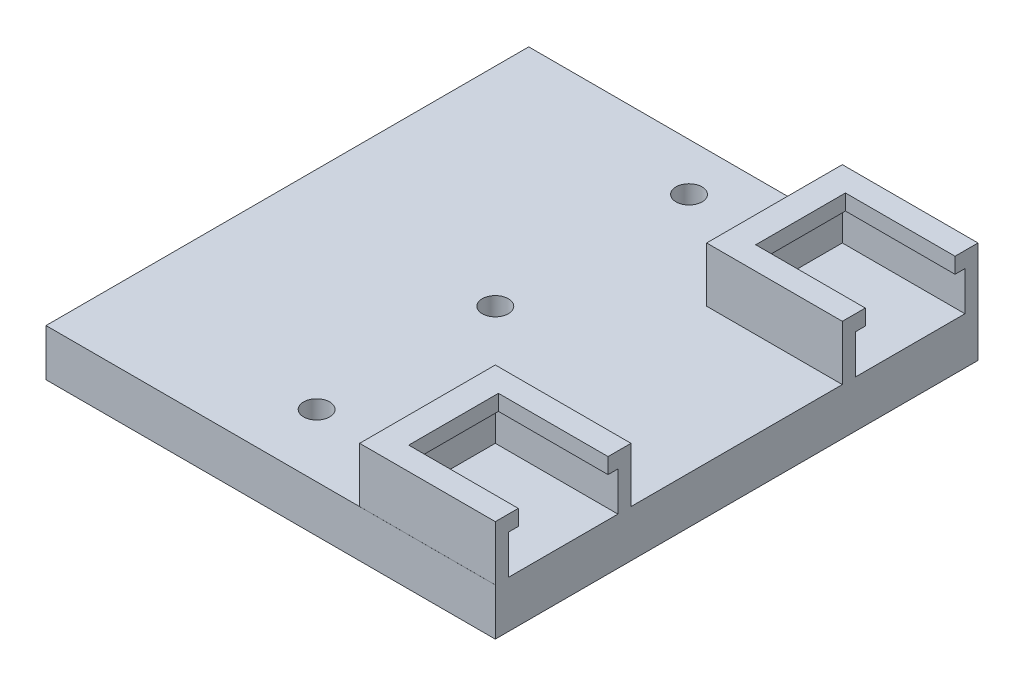
ISO-10303-21;
HEADER;
FILE_DESCRIPTION(('STEP AP214'),'2;1');
FILE_NAME('part.step','',(''),(''),'','','');
FILE_SCHEMA(('AUTOMOTIVE_DESIGN { 1 0 10303 214 1 1 1 1 }'));
ENDSEC;
DATA;
#1=APPLICATION_CONTEXT('core data for automotive mechanical design processes');
#2=APPLICATION_PROTOCOL_DEFINITION('international standard','automotive_design',2000,#1);
#3=PRODUCT_CONTEXT('',#1,'mechanical');
#4=PRODUCT('Part','Part','',(#3));
#5=PRODUCT_RELATED_PRODUCT_CATEGORY('part','',(#4));
#6=PRODUCT_DEFINITION_FORMATION('','',#4);
#7=PRODUCT_DEFINITION_CONTEXT('part definition',#1,'design');
#8=PRODUCT_DEFINITION('design','',#6,#7);
#9=PRODUCT_DEFINITION_SHAPE('','',#8);
#10=(LENGTH_UNIT() NAMED_UNIT(*) SI_UNIT(.MILLI.,.METRE.));
#11=(NAMED_UNIT(*) PLANE_ANGLE_UNIT() SI_UNIT($,.RADIAN.));
#12=(NAMED_UNIT(*) SI_UNIT($,.STERADIAN.) SOLID_ANGLE_UNIT());
#13=UNCERTAINTY_MEASURE_WITH_UNIT(LENGTH_MEASURE(1.E-05),#10,'distance_accuracy_value','');
#14=(GEOMETRIC_REPRESENTATION_CONTEXT(3) GLOBAL_UNCERTAINTY_ASSIGNED_CONTEXT((#13)) GLOBAL_UNIT_ASSIGNED_CONTEXT((#10,
#11,#12)) REPRESENTATION_CONTEXT('',''));
#15=CARTESIAN_POINT('',(0.,0.,0.));
#16=DIRECTION('',(0.,0.,1.));
#17=DIRECTION('',(1.,0.,0.));
#18=AXIS2_PLACEMENT_3D('',#15,#16,#17);
#19=CARTESIAN_POINT('',(0.,0.,0.));
#20=DIRECTION('',(0.,-1.,0.));
#21=DIRECTION('',(0.,0.,-1.));
#22=AXIS2_PLACEMENT_3D('',#19,#20,#21);
#23=PLANE('',#22);
#24=CARTESIAN_POINT('',(0.,0.,34.2453079122047));
#25=DIRECTION('',(0.,-1.,0.));
#26=DIRECTION('',(0.,0.,-1.));
#27=AXIS2_PLACEMENT_3D('',#24,#25,#26);
#28=CIRCLE('',#27,2.5);
#29=CARTESIAN_POINT('',(0.,0.,31.7453079122047));
#30=VERTEX_POINT('',#29);
#31=EDGE_CURVE('E456',#30,#30,#28,.T.);
#32=ORIENTED_EDGE('',*,*,#31,.F.);
#33=EDGE_LOOP('',(#32));
#34=FACE_BOUND('',#33,.T.);
#35=CARTESIAN_POINT('',(0.,0.,-37.1263663216455));
#36=DIRECTION('',(0.,-1.,0.));
#37=DIRECTION('',(0.,0.,-1.));
#38=AXIS2_PLACEMENT_3D('',#35,#36,#37);
#39=CIRCLE('',#38,2.5);
#40=CARTESIAN_POINT('',(0.,0.,-39.6263663216455));
#41=VERTEX_POINT('',#40);
#42=EDGE_CURVE('E449',#41,#41,#39,.T.);
#43=ORIENTED_EDGE('',*,*,#42,.F.);
#44=EDGE_LOOP('',(#43));
#45=FACE_BOUND('',#44,.T.);
#46=CARTESIAN_POINT('',(0.,0.,0.));
#47=DIRECTION('',(0.,-1.,0.));
#48=DIRECTION('',(0.,0.,-1.));
#49=AXIS2_PLACEMENT_3D('',#46,#47,#48);
#50=CIRCLE('',#49,2.5);
#51=CARTESIAN_POINT('',(0.,0.,-2.5));
#52=VERTEX_POINT('',#51);
#53=EDGE_CURVE('E269',#52,#52,#50,.T.);
#54=ORIENTED_EDGE('',*,*,#53,.F.);
#55=EDGE_LOOP('',(#54));
#56=FACE_BOUND('',#55,.T.);
#57=DIRECTION('',(1.,0.,0.));
#58=VECTOR('',#57,1.);
#59=CARTESIAN_POINT('',(0.,0.,-46.25));
#60=LINE('',#59,#58);
#61=CARTESIAN_POINT('',(-39.8470236313173,0.,-46.25));
#62=VERTEX_POINT('',#61);
#63=CARTESIAN_POINT('',(46.25,0.,-46.25));
#64=VERTEX_POINT('',#63);
#65=EDGE_CURVE('E228',#62,#64,#60,.T.);
#66=ORIENTED_EDGE('',*,*,#65,.T.);
#67=DIRECTION('',(0.,0.,1.));
#68=VECTOR('',#67,1.);
#69=CARTESIAN_POINT('',(46.25,0.,0.));
#70=LINE('',#69,#68);
#71=CARTESIAN_POINT('',(46.25,0.,46.258019));
#72=VERTEX_POINT('',#71);
#73=EDGE_CURVE('E263',#64,#72,#70,.T.);
#74=ORIENTED_EDGE('',*,*,#73,.T.);
#75=DIRECTION('',(-1.,0.,0.));
#76=VECTOR('',#75,1.);
#77=CARTESIAN_POINT('',(0.,0.,46.258019));
#78=LINE('',#77,#76);
#79=CARTESIAN_POINT('',(-39.8470236313173,0.,46.258019));
#80=VERTEX_POINT('',#79);
#81=EDGE_CURVE('E260',#72,#80,#78,.T.);
#82=ORIENTED_EDGE('',*,*,#81,.T.);
#83=DIRECTION('',(0.,0.,-1.));
#84=VECTOR('',#83,1.);
#85=CARTESIAN_POINT('',(-39.8470236313173,0.,0.));
#86=LINE('',#85,#84);
#87=EDGE_CURVE('E258',#80,#62,#86,.T.);
#88=ORIENTED_EDGE('',*,*,#87,.T.);
#89=EDGE_LOOP('',(#66,#74,#82,#88));
#90=FACE_BOUND('',#89,.T.);
#91=ADVANCED_FACE('F35',(#34,#45,#56,#90),#23,.T.);
#92=CARTESIAN_POINT('',(0.,9.,-69.5));
#93=DIRECTION('',(0.,-1.,0.));
#94=DIRECTION('',(0.,0.,-1.));
#95=AXIS2_PLACEMENT_3D('',#92,#93,#94);
#96=PLANE('',#95);
#97=DIRECTION('',(0.,0.,-1.));
#98=VECTOR('',#97,1.);
#99=CARTESIAN_POINT('',(46.25,9.,-46.25));
#100=LINE('',#99,#98);
#101=CARTESIAN_POINT('',(46.25,9.,-22.75));
#102=VERTEX_POINT('',#101);
#103=CARTESIAN_POINT('',(46.25,9.,-43.75));
#104=VERTEX_POINT('',#103);
#105=EDGE_CURVE('E250',#102,#104,#100,.T.);
#106=ORIENTED_EDGE('',*,*,#105,.T.);
#107=DIRECTION('',(-1.,0.,0.));
#108=VECTOR('',#107,1.);
#109=CARTESIAN_POINT('',(0.,9.,-43.75));
#110=LINE('',#109,#108);
#111=CARTESIAN_POINT('',(22.75,9.,-43.75));
#112=VERTEX_POINT('',#111);
#113=EDGE_CURVE('E310',#104,#112,#110,.T.);
#114=ORIENTED_EDGE('',*,*,#113,.T.);
#115=DIRECTION('',(0.,0.,-1.));
#116=VECTOR('',#115,1.);
#117=CARTESIAN_POINT('',(22.75,9.,0.));
#118=LINE('',#117,#116);
#119=CARTESIAN_POINT('',(22.75,9.,-22.75));
#120=VERTEX_POINT('',#119);
#121=EDGE_CURVE('E361',#120,#112,#118,.T.);
#122=ORIENTED_EDGE('',*,*,#121,.F.);
#123=DIRECTION('',(1.,0.,0.));
#124=VECTOR('',#123,1.);
#125=CARTESIAN_POINT('',(0.,9.,-22.75));
#126=LINE('',#125,#124);
#127=EDGE_CURVE('E365',#120,#102,#126,.T.);
#128=ORIENTED_EDGE('',*,*,#127,.T.);
#129=EDGE_LOOP('',(#106,#114,#122,#128));
#130=FACE_BOUND('',#129,.T.);
#131=ADVANCED_FACE('F469',(#130),#96,.F.);
#132=CARTESIAN_POINT('',(0.,9.,34.2453079122047));
#133=DIRECTION('',(0.,1.,0.));
#134=DIRECTION('',(0.,0.,1.));
#135=AXIS2_PLACEMENT_3D('',#132,#133,#134);
#136=CIRCLE('',#135,2.5);
#137=CARTESIAN_POINT('',(0.,9.,36.7453079122047));
#138=VERTEX_POINT('',#137);
#139=EDGE_CURVE('E461',#138,#138,#136,.T.);
#140=ORIENTED_EDGE('',*,*,#139,.F.);
#141=EDGE_LOOP('',(#140));
#142=FACE_BOUND('',#141,.T.);
#143=CARTESIAN_POINT('',(0.,9.,-37.1263663216455));
#144=DIRECTION('',(0.,1.,0.));
#145=DIRECTION('',(0.,0.,1.));
#146=AXIS2_PLACEMENT_3D('',#143,#144,#145);
#147=CIRCLE('',#146,2.5);
#148=CARTESIAN_POINT('',(0.,9.,-34.6263663216455));
#149=VERTEX_POINT('',#148);
#150=EDGE_CURVE('E452',#149,#149,#147,.T.);
#151=ORIENTED_EDGE('',*,*,#150,.F.);
#152=EDGE_LOOP('',(#151));
#153=FACE_BOUND('',#152,.T.);
#154=CARTESIAN_POINT('',(0.,9.,0.));
#155=DIRECTION('',(0.,1.,0.));
#156=DIRECTION('',(0.,0.,1.));
#157=AXIS2_PLACEMENT_3D('',#154,#155,#156);
#158=CIRCLE('',#157,2.5);
#159=CARTESIAN_POINT('',(0.,9.,2.5));
#160=VERTEX_POINT('',#159);
#161=EDGE_CURVE('E266',#160,#160,#158,.T.);
#162=ORIENTED_EDGE('',*,*,#161,.F.);
#163=EDGE_LOOP('',(#162));
#164=FACE_BOUND('',#163,.T.);
#165=CARTESIAN_POINT('',(46.25,9.,20.25));
#166=VERTEX_POINT('',#165);
#167=CARTESIAN_POINT('',(46.25,9.,-20.25));
#168=VERTEX_POINT('',#167);
#169=EDGE_CURVE('E447',#166,#168,#100,.T.);
#170=ORIENTED_EDGE('',*,*,#169,.T.);
#171=DIRECTION('',(-1.,0.,0.));
#172=VECTOR('',#171,1.);
#173=CARTESIAN_POINT('',(0.,9.,-20.25));
#174=LINE('',#173,#172);
#175=CARTESIAN_POINT('',(20.25,9.,-20.25));
#176=VERTEX_POINT('',#175);
#177=EDGE_CURVE('E368',#168,#176,#174,.T.);
#178=ORIENTED_EDGE('',*,*,#177,.T.);
#179=DIRECTION('',(0.,0.,-1.));
#180=VECTOR('',#179,1.);
#181=CARTESIAN_POINT('',(20.25,9.,0.));
#182=LINE('',#181,#180);
#183=CARTESIAN_POINT('',(20.25,9.,-46.25));
#184=VERTEX_POINT('',#183);
#185=EDGE_CURVE('E244',#176,#184,#182,.T.);
#186=ORIENTED_EDGE('',*,*,#185,.T.);
#187=DIRECTION('',(-1.,0.,0.));
#188=VECTOR('',#187,1.);
#189=CARTESIAN_POINT('',(46.25,9.,-46.25));
#190=LINE('',#189,#188);
#191=CARTESIAN_POINT('',(-39.8470236313173,9.,-46.25));
#192=VERTEX_POINT('',#191);
#193=EDGE_CURVE('E225',#184,#192,#190,.T.);
#194=ORIENTED_EDGE('',*,*,#193,.T.);
#195=DIRECTION('',(0.,0.,1.));
#196=VECTOR('',#195,1.);
#197=CARTESIAN_POINT('',(-39.8470236313173,9.,-46.25));
#198=LINE('',#197,#196);
#199=CARTESIAN_POINT('',(-39.8470236313173,9.,46.258019));
#200=VERTEX_POINT('',#199);
#201=EDGE_CURVE('E235',#192,#200,#198,.T.);
#202=ORIENTED_EDGE('',*,*,#201,.T.);
#203=DIRECTION('',(1.,0.,0.));
#204=VECTOR('',#203,1.);
#205=CARTESIAN_POINT('',(46.25,9.,46.258019));
#206=LINE('',#205,#204);
#207=CARTESIAN_POINT('',(46.25,9.,46.258019));
#208=VERTEX_POINT('',#207);
#209=EDGE_CURVE('E232',#200,#208,#206,.T.);
#210=ORIENTED_EDGE('',*,*,#209,.T.);
#211=CARTESIAN_POINT('',(46.25,9.,46.25));
#212=VERTEX_POINT('',#211);
#213=EDGE_CURVE('E246',#208,#212,#100,.T.);
#214=ORIENTED_EDGE('',*,*,#213,.T.);
#215=DIRECTION('',(-1.,0.,0.));
#216=VECTOR('',#215,1.);
#217=CARTESIAN_POINT('',(0.,9.,46.25));
#218=LINE('',#217,#216);
#219=CARTESIAN_POINT('',(20.25,9.,46.25));
#220=VERTEX_POINT('',#219);
#221=EDGE_CURVE('E320',#212,#220,#218,.T.);
#222=ORIENTED_EDGE('',*,*,#221,.T.);
#223=DIRECTION('',(0.,0.,1.));
#224=VECTOR('',#223,1.);
#225=CARTESIAN_POINT('',(20.25,9.,0.));
#226=LINE('',#225,#224);
#227=CARTESIAN_POINT('',(20.25,9.,20.25));
#228=VERTEX_POINT('',#227);
#229=EDGE_CURVE('E290',#228,#220,#226,.T.);
#230=ORIENTED_EDGE('',*,*,#229,.F.);
#231=DIRECTION('',(-1.,0.,0.));
#232=VECTOR('',#231,1.);
#233=CARTESIAN_POINT('',(0.,9.,20.25));
#234=LINE('',#233,#232);
#235=EDGE_CURVE('E291',#166,#228,#234,.T.);
#236=ORIENTED_EDGE('',*,*,#235,.F.);
#237=EDGE_LOOP('',(#170,#178,#186,#194,#202,#210,#214,#222,#230,#236));
#238=FACE_BOUND('',#237,.T.);
#239=ADVANCED_FACE('F242',(#142,#153,#164,#238),#96,.F.);
#240=CARTESIAN_POINT('',(46.25,9.,43.75));
#241=VERTEX_POINT('',#240);
#242=CARTESIAN_POINT('',(46.25,9.,22.75));
#243=VERTEX_POINT('',#242);
#244=EDGE_CURVE('E248',#241,#243,#100,.T.);
#245=ORIENTED_EDGE('',*,*,#244,.T.);
#246=DIRECTION('',(-1.,0.,0.));
#247=VECTOR('',#246,1.);
#248=CARTESIAN_POINT('',(0.,9.,22.75));
#249=LINE('',#248,#247);
#250=CARTESIAN_POINT('',(22.75,9.,22.75));
#251=VERTEX_POINT('',#250);
#252=EDGE_CURVE('E317',#243,#251,#249,.T.);
#253=ORIENTED_EDGE('',*,*,#252,.T.);
#254=DIRECTION('',(0.,0.,1.));
#255=VECTOR('',#254,1.);
#256=CARTESIAN_POINT('',(22.75,9.,0.));
#257=LINE('',#256,#255);
#258=CARTESIAN_POINT('',(22.75,9.,43.75));
#259=VERTEX_POINT('',#258);
#260=EDGE_CURVE('E313',#251,#259,#257,.T.);
#261=ORIENTED_EDGE('',*,*,#260,.T.);
#262=DIRECTION('',(1.,0.,0.));
#263=VECTOR('',#262,1.);
#264=CARTESIAN_POINT('',(0.,9.,43.75));
#265=LINE('',#264,#263);
#266=EDGE_CURVE('E316',#259,#241,#265,.T.);
#267=ORIENTED_EDGE('',*,*,#266,.T.);
#268=EDGE_LOOP('',(#245,#253,#261,#267));
#269=FACE_BOUND('',#268,.T.);
#270=ADVANCED_FACE('F444',(#269),#96,.F.);
#271=CARTESIAN_POINT('',(46.25,19.5,0.));
#272=DIRECTION('',(1.,0.,0.));
#273=DIRECTION('',(0.,0.,-1.));
#274=AXIS2_PLACEMENT_3D('',#271,#272,#273);
#275=PLANE('',#274);
#276=DIRECTION('',(0.,1.,0.));
#277=VECTOR('',#276,1.);
#278=CARTESIAN_POINT('',(46.25,19.5,24.65));
#279=LINE('',#278,#277);
#280=CARTESIAN_POINT('',(46.25,16.5,24.65));
#281=VERTEX_POINT('',#280);
#282=CARTESIAN_POINT('',(46.25,19.5,24.65));
#283=VERTEX_POINT('',#282);
#284=EDGE_CURVE('E106',#281,#283,#279,.T.);
#285=ORIENTED_EDGE('',*,*,#284,.F.);
#286=DIRECTION('',(0.,0.,-1.));
#287=VECTOR('',#286,1.);
#288=CARTESIAN_POINT('',(46.25,16.5,43.75));
#289=LINE('',#288,#287);
#290=CARTESIAN_POINT('',(46.25,16.5,22.75));
#291=VERTEX_POINT('',#290);
#292=EDGE_CURVE('E272',#281,#291,#289,.T.);
#293=ORIENTED_EDGE('',*,*,#292,.T.);
#294=DIRECTION('',(0.,-1.,0.));
#295=VECTOR('',#294,1.);
#296=CARTESIAN_POINT('',(46.25,19.5,22.75));
#297=LINE('',#296,#295);
#298=EDGE_CURVE('E283',#291,#243,#297,.T.);
#299=ORIENTED_EDGE('',*,*,#298,.T.);
#300=ORIENTED_EDGE('',*,*,#244,.F.);
#301=DIRECTION('',(0.,-1.,0.));
#302=VECTOR('',#301,1.);
#303=CARTESIAN_POINT('',(46.25,19.5,43.75));
#304=LINE('',#303,#302);
#305=CARTESIAN_POINT('',(46.25,16.5,43.75));
#306=VERTEX_POINT('',#305);
#307=EDGE_CURVE('E304',#306,#241,#304,.T.);
#308=ORIENTED_EDGE('',*,*,#307,.F.);
#309=CARTESIAN_POINT('',(46.25,16.5,41.85));
#310=VERTEX_POINT('',#309);
#311=EDGE_CURVE('E302',#306,#310,#289,.T.);
#312=ORIENTED_EDGE('',*,*,#311,.T.);
#313=DIRECTION('',(0.,-1.,0.));
#314=VECTOR('',#313,1.);
#315=CARTESIAN_POINT('',(46.25,19.5,41.85));
#316=LINE('',#315,#314);
#317=CARTESIAN_POINT('',(46.25,19.5,41.85));
#318=VERTEX_POINT('',#317);
#319=EDGE_CURVE('E398',#318,#310,#316,.T.);
#320=ORIENTED_EDGE('',*,*,#319,.F.);
#321=DIRECTION('',(0.,0.,1.));
#322=VECTOR('',#321,1.);
#323=CARTESIAN_POINT('',(46.25,19.5,0.));
#324=LINE('',#323,#322);
#325=CARTESIAN_POINT('',(46.25,19.5,46.25));
#326=VERTEX_POINT('',#325);
#327=EDGE_CURVE('E303',#318,#326,#324,.T.);
#328=ORIENTED_EDGE('',*,*,#327,.T.);
#329=DIRECTION('',(0.,-1.,0.));
#330=VECTOR('',#329,1.);
#331=CARTESIAN_POINT('',(46.25,19.5,46.25));
#332=LINE('',#331,#330);
#333=EDGE_CURVE('E299',#326,#212,#332,.T.);
#334=ORIENTED_EDGE('',*,*,#333,.T.);
#335=ORIENTED_EDGE('',*,*,#213,.F.);
#336=DIRECTION('',(0.,1.,0.));
#337=VECTOR('',#336,1.);
#338=CARTESIAN_POINT('',(46.25,-1.,46.258019));
#339=LINE('',#338,#337);
#340=EDGE_CURVE('E254',#72,#208,#339,.T.);
#341=ORIENTED_EDGE('',*,*,#340,.F.);
#342=ORIENTED_EDGE('',*,*,#73,.F.);
#343=DIRECTION('',(0.,-1.,0.));
#344=VECTOR('',#343,1.);
#345=CARTESIAN_POINT('',(46.25,19.5,-46.25));
#346=LINE('',#345,#344);
#347=CARTESIAN_POINT('',(46.25,19.5,-46.25));
#348=VERTEX_POINT('',#347);
#349=EDGE_CURVE('E52',#348,#64,#346,.T.);
#350=ORIENTED_EDGE('',*,*,#349,.F.);
#351=DIRECTION('',(0.,0.,-1.));
#352=VECTOR('',#351,1.);
#353=CARTESIAN_POINT('',(46.25,19.5,0.));
#354=LINE('',#353,#352);
#355=CARTESIAN_POINT('',(46.25,19.5,-41.85));
#356=VERTEX_POINT('',#355);
#357=EDGE_CURVE('E351',#356,#348,#354,.T.);
#358=ORIENTED_EDGE('',*,*,#357,.F.);
#359=DIRECTION('',(0.,-1.,0.));
#360=VECTOR('',#359,1.);
#361=CARTESIAN_POINT('',(46.25,19.5,-41.85));
#362=LINE('',#361,#360);
#363=CARTESIAN_POINT('',(46.25,16.5,-41.85));
#364=VERTEX_POINT('',#363);
#365=EDGE_CURVE('E336',#356,#364,#362,.T.);
#366=ORIENTED_EDGE('',*,*,#365,.T.);
#367=DIRECTION('',(0.,0.,-1.));
#368=VECTOR('',#367,1.);
#369=CARTESIAN_POINT('',(46.25,16.5,-22.75));
#370=LINE('',#369,#368);
#371=CARTESIAN_POINT('',(46.25,16.5,-43.75));
#372=VERTEX_POINT('',#371);
#373=EDGE_CURVE('E341',#364,#372,#370,.T.);
#374=ORIENTED_EDGE('',*,*,#373,.T.);
#375=DIRECTION('',(0.,-1.,0.));
#376=VECTOR('',#375,1.);
#377=CARTESIAN_POINT('',(46.25,19.5,-43.75));
#378=LINE('',#377,#376);
#379=EDGE_CURVE('E337',#372,#104,#378,.T.);
#380=ORIENTED_EDGE('',*,*,#379,.T.);
#381=ORIENTED_EDGE('',*,*,#105,.F.);
#382=DIRECTION('',(0.,-1.,0.));
#383=VECTOR('',#382,1.);
#384=CARTESIAN_POINT('',(46.25,19.5,-22.75));
#385=LINE('',#384,#383);
#386=CARTESIAN_POINT('',(46.25,16.5,-22.75));
#387=VERTEX_POINT('',#386);
#388=EDGE_CURVE('E355',#387,#102,#385,.T.);
#389=ORIENTED_EDGE('',*,*,#388,.F.);
#390=CARTESIAN_POINT('',(46.25,16.5,-24.65));
#391=VERTEX_POINT('',#390);
#392=EDGE_CURVE('E332',#387,#391,#370,.T.);
#393=ORIENTED_EDGE('',*,*,#392,.T.);
#394=DIRECTION('',(0.,1.,0.));
#395=VECTOR('',#394,1.);
#396=CARTESIAN_POINT('',(46.25,19.5,-24.65));
#397=LINE('',#396,#395);
#398=CARTESIAN_POINT('',(46.25,19.5,-24.65));
#399=VERTEX_POINT('',#398);
#400=EDGE_CURVE('E354',#391,#399,#397,.T.);
#401=ORIENTED_EDGE('',*,*,#400,.T.);
#402=CARTESIAN_POINT('',(46.25,19.5,-20.25));
#403=VERTEX_POINT('',#402);
#404=EDGE_CURVE('E277',#403,#399,#354,.T.);
#405=ORIENTED_EDGE('',*,*,#404,.F.);
#406=DIRECTION('',(0.,-1.,0.));
#407=VECTOR('',#406,1.);
#408=CARTESIAN_POINT('',(46.25,19.5,-20.25));
#409=LINE('',#408,#407);
#410=EDGE_CURVE('E344',#403,#168,#409,.T.);
#411=ORIENTED_EDGE('',*,*,#410,.T.);
#412=ORIENTED_EDGE('',*,*,#169,.F.);
#413=DIRECTION('',(0.,-1.,0.));
#414=VECTOR('',#413,1.);
#415=CARTESIAN_POINT('',(46.25,19.5,20.25));
#416=LINE('',#415,#414);
#417=CARTESIAN_POINT('',(46.25,19.5,20.25));
#418=VERTEX_POINT('',#417);
#419=EDGE_CURVE('E287',#418,#166,#416,.T.);
#420=ORIENTED_EDGE('',*,*,#419,.F.);
#421=EDGE_CURVE('E286',#418,#283,#324,.T.);
#422=ORIENTED_EDGE('',*,*,#421,.T.);
#423=EDGE_LOOP('',(#285,#293,#299,#300,#308,#312,#320,#328,#334,#335,#341,#342,#350,#358,#366,
#374,#380,#381,#389,#393,#401,#405,#411,#412,#420,#422));
#424=FACE_BOUND('',#423,.T.);
#425=ADVANCED_FACE('F437',(#424),#275,.T.);
#426=CARTESIAN_POINT('',(0.,19.5,-43.75));
#427=DIRECTION('',(0.,0.,1.));
#428=DIRECTION('',(1.,0.,0.));
#429=AXIS2_PLACEMENT_3D('',#426,#427,#428);
#430=PLANE('',#429);
#431=ORIENTED_EDGE('',*,*,#379,.F.);
#432=DIRECTION('',(-1.,0.,0.));
#433=VECTOR('',#432,1.);
#434=CARTESIAN_POINT('',(67.4632034355964,16.5,-43.75));
#435=LINE('',#434,#433);
#436=CARTESIAN_POINT('',(22.75,16.5,-43.75));
#437=VERTEX_POINT('',#436);
#438=EDGE_CURVE('E340',#372,#437,#435,.T.);
#439=ORIENTED_EDGE('',*,*,#438,.T.);
#440=DIRECTION('',(0.,-1.,0.));
#441=VECTOR('',#440,1.);
#442=CARTESIAN_POINT('',(22.75,19.5,-43.75));
#443=LINE('',#442,#441);
#444=EDGE_CURVE('E359',#437,#112,#443,.T.);
#445=ORIENTED_EDGE('',*,*,#444,.T.);
#446=ORIENTED_EDGE('',*,*,#113,.F.);
#447=EDGE_LOOP('',(#431,#439,#445,#446));
#448=FACE_BOUND('',#447,.T.);
#449=ADVANCED_FACE('F519',(#448),#430,.T.);
#450=CARTESIAN_POINT('',(0.,19.5,-22.75));
#451=DIRECTION('',(0.,0.,-1.));
#452=DIRECTION('',(-1.,0.,0.));
#453=AXIS2_PLACEMENT_3D('',#450,#451,#452);
#454=PLANE('',#453);
#455=DIRECTION('',(0.,-1.,0.));
#456=VECTOR('',#455,1.);
#457=CARTESIAN_POINT('',(22.75,19.5,-22.75));
#458=LINE('',#457,#456);
#459=CARTESIAN_POINT('',(22.75,16.5,-22.75));
#460=VERTEX_POINT('',#459);
#461=EDGE_CURVE('E358',#460,#120,#458,.T.);
#462=ORIENTED_EDGE('',*,*,#461,.F.);
#463=DIRECTION('',(-1.,0.,0.));
#464=VECTOR('',#463,1.);
#465=CARTESIAN_POINT('',(67.4632034355964,16.5,-22.75));
#466=LINE('',#465,#464);
#467=EDGE_CURVE('E281',#387,#460,#466,.T.);
#468=ORIENTED_EDGE('',*,*,#467,.F.);
#469=ORIENTED_EDGE('',*,*,#388,.T.);
#470=ORIENTED_EDGE('',*,*,#127,.F.);
#471=EDGE_LOOP('',(#462,#468,#469,#470));
#472=FACE_BOUND('',#471,.T.);
#473=ADVANCED_FACE('F531',(#472),#454,.T.);
#474=CARTESIAN_POINT('',(22.75,19.5,0.));
#475=DIRECTION('',(-1.,0.,0.));
#476=DIRECTION('',(0.,0.,1.));
#477=AXIS2_PLACEMENT_3D('',#474,#475,#476);
#478=PLANE('',#477);
#479=DIRECTION('',(0.,0.,-1.));
#480=VECTOR('',#479,1.);
#481=CARTESIAN_POINT('',(22.75,16.5,-22.75));
#482=LINE('',#481,#480);
#483=EDGE_CURVE('E391',#460,#437,#482,.T.);
#484=ORIENTED_EDGE('',*,*,#483,.F.);
#485=ORIENTED_EDGE('',*,*,#461,.T.);
#486=ORIENTED_EDGE('',*,*,#121,.T.);
#487=ORIENTED_EDGE('',*,*,#444,.F.);
#488=EDGE_LOOP('',(#484,#485,#486,#487));
#489=FACE_BOUND('',#488,.T.);
#490=ADVANCED_FACE('F502',(#489),#478,.F.);
#491=CARTESIAN_POINT('',(0.,19.5,22.75));
#492=DIRECTION('',(0.,0.,1.));
#493=DIRECTION('',(1.,0.,0.));
#494=AXIS2_PLACEMENT_3D('',#491,#492,#493);
#495=PLANE('',#494);
#496=ORIENTED_EDGE('',*,*,#298,.F.);
#497=DIRECTION('',(-1.,0.,0.));
#498=VECTOR('',#497,1.);
#499=CARTESIAN_POINT('',(67.4632034355964,16.5,22.75));
#500=LINE('',#499,#498);
#501=CARTESIAN_POINT('',(22.75,16.5,22.75));
#502=VERTEX_POINT('',#501);
#503=EDGE_CURVE('E312',#291,#502,#500,.T.);
#504=ORIENTED_EDGE('',*,*,#503,.T.);
#505=DIRECTION('',(0.,-1.,0.));
#506=VECTOR('',#505,1.);
#507=CARTESIAN_POINT('',(22.75,19.5,22.75));
#508=LINE('',#507,#506);
#509=EDGE_CURVE('E308',#502,#251,#508,.T.);
#510=ORIENTED_EDGE('',*,*,#509,.T.);
#511=ORIENTED_EDGE('',*,*,#252,.F.);
#512=EDGE_LOOP('',(#496,#504,#510,#511));
#513=FACE_BOUND('',#512,.T.);
#514=ADVANCED_FACE('F440',(#513),#495,.T.);
#515=CARTESIAN_POINT('',(0.,19.5,43.75));
#516=DIRECTION('',(0.,0.,-1.));
#517=DIRECTION('',(-1.,0.,0.));
#518=AXIS2_PLACEMENT_3D('',#515,#516,#517);
#519=PLANE('',#518);
#520=DIRECTION('',(0.,-1.,0.));
#521=VECTOR('',#520,1.);
#522=CARTESIAN_POINT('',(22.75,19.5,43.75));
#523=LINE('',#522,#521);
#524=CARTESIAN_POINT('',(22.75,16.5,43.75));
#525=VERTEX_POINT('',#524);
#526=EDGE_CURVE('E307',#525,#259,#523,.T.);
#527=ORIENTED_EDGE('',*,*,#526,.F.);
#528=DIRECTION('',(-1.,0.,0.));
#529=VECTOR('',#528,1.);
#530=CARTESIAN_POINT('',(67.4632034355964,16.5,43.75));
#531=LINE('',#530,#529);
#532=EDGE_CURVE('E276',#306,#525,#531,.T.);
#533=ORIENTED_EDGE('',*,*,#532,.F.);
#534=ORIENTED_EDGE('',*,*,#307,.T.);
#535=ORIENTED_EDGE('',*,*,#266,.F.);
#536=EDGE_LOOP('',(#527,#533,#534,#535));
#537=FACE_BOUND('',#536,.T.);
#538=ADVANCED_FACE('F501',(#537),#519,.T.);
#539=CARTESIAN_POINT('',(22.75,19.5,0.));
#540=DIRECTION('',(1.,0.,0.));
#541=DIRECTION('',(0.,0.,-1.));
#542=AXIS2_PLACEMENT_3D('',#539,#540,#541);
#543=PLANE('',#542);
#544=ORIENTED_EDGE('',*,*,#509,.F.);
#545=DIRECTION('',(0.,0.,-1.));
#546=VECTOR('',#545,1.);
#547=CARTESIAN_POINT('',(22.75,16.5,43.75));
#548=LINE('',#547,#546);
#549=EDGE_CURVE('E282',#525,#502,#548,.T.);
#550=ORIENTED_EDGE('',*,*,#549,.F.);
#551=ORIENTED_EDGE('',*,*,#526,.T.);
#552=ORIENTED_EDGE('',*,*,#260,.F.);
#553=EDGE_LOOP('',(#544,#550,#551,#552));
#554=FACE_BOUND('',#553,.T.);
#555=ADVANCED_FACE('F507',(#554),#543,.T.);
#556=CARTESIAN_POINT('',(0.,19.5,20.25));
#557=DIRECTION('',(0.,0.,1.));
#558=DIRECTION('',(1.,0.,0.));
#559=AXIS2_PLACEMENT_3D('',#556,#557,#558);
#560=PLANE('',#559);
#561=ORIENTED_EDGE('',*,*,#235,.T.);
#562=DIRECTION('',(0.,-1.,0.));
#563=VECTOR('',#562,1.);
#564=CARTESIAN_POINT('',(20.25,19.5,20.25));
#565=LINE('',#564,#563);
#566=CARTESIAN_POINT('',(20.25,19.5,20.25));
#567=VERTEX_POINT('',#566);
#568=EDGE_CURVE('E292',#567,#228,#565,.T.);
#569=ORIENTED_EDGE('',*,*,#568,.F.);
#570=DIRECTION('',(-1.,0.,0.));
#571=VECTOR('',#570,1.);
#572=CARTESIAN_POINT('',(0.,19.5,20.25));
#573=LINE('',#572,#571);
#574=EDGE_CURVE('E298',#418,#567,#573,.T.);
#575=ORIENTED_EDGE('',*,*,#574,.F.);
#576=ORIENTED_EDGE('',*,*,#419,.T.);
#577=EDGE_LOOP('',(#561,#569,#575,#576));
#578=FACE_BOUND('',#577,.T.);
#579=ADVANCED_FACE('F503',(#578),#560,.F.);
#580=CARTESIAN_POINT('',(20.25,19.5,0.));
#581=DIRECTION('',(1.,0.,0.));
#582=DIRECTION('',(0.,0.,-1.));
#583=AXIS2_PLACEMENT_3D('',#580,#581,#582);
#584=PLANE('',#583);
#585=ORIENTED_EDGE('',*,*,#229,.T.);
#586=DIRECTION('',(0.,-1.,0.));
#587=VECTOR('',#586,1.);
#588=CARTESIAN_POINT('',(20.25,19.5,46.25));
#589=LINE('',#588,#587);
#590=CARTESIAN_POINT('',(20.25,19.5,46.25));
#591=VERTEX_POINT('',#590);
#592=EDGE_CURVE('E296',#591,#220,#589,.T.);
#593=ORIENTED_EDGE('',*,*,#592,.F.);
#594=DIRECTION('',(0.,0.,1.));
#595=VECTOR('',#594,1.);
#596=CARTESIAN_POINT('',(20.25,19.5,0.));
#597=LINE('',#596,#595);
#598=EDGE_CURVE('E330',#567,#591,#597,.T.);
#599=ORIENTED_EDGE('',*,*,#598,.F.);
#600=ORIENTED_EDGE('',*,*,#568,.T.);
#601=EDGE_LOOP('',(#585,#593,#599,#600));
#602=FACE_BOUND('',#601,.T.);
#603=ADVANCED_FACE('F506',(#602),#584,.F.);
#604=CARTESIAN_POINT('',(0.,19.5,46.25));
#605=DIRECTION('',(0.,0.,1.));
#606=DIRECTION('',(1.,0.,0.));
#607=AXIS2_PLACEMENT_3D('',#604,#605,#606);
#608=PLANE('',#607);
#609=ORIENTED_EDGE('',*,*,#221,.F.);
#610=ORIENTED_EDGE('',*,*,#333,.F.);
#611=DIRECTION('',(-1.,0.,0.));
#612=VECTOR('',#611,1.);
#613=CARTESIAN_POINT('',(0.,19.5,46.25));
#614=LINE('',#613,#612);
#615=EDGE_CURVE('E295',#326,#591,#614,.T.);
#616=ORIENTED_EDGE('',*,*,#615,.T.);
#617=ORIENTED_EDGE('',*,*,#592,.T.);
#618=EDGE_LOOP('',(#609,#610,#616,#617));
#619=FACE_BOUND('',#618,.T.);
#620=ADVANCED_FACE('F511',(#619),#608,.T.);
#621=CARTESIAN_POINT('',(0.,19.5,0.));
#622=DIRECTION('',(0.,1.,0.));
#623=DIRECTION('',(0.,0.,1.));
#624=AXIS2_PLACEMENT_3D('',#621,#622,#623);
#625=PLANE('',#624);
#626=DIRECTION('',(-1.,0.,0.));
#627=VECTOR('',#626,1.);
#628=CARTESIAN_POINT('',(67.25,19.5,24.65));
#629=LINE('',#628,#627);
#630=CARTESIAN_POINT('',(25.25,19.5,24.65));
#631=VERTEX_POINT('',#630);
#632=EDGE_CURVE('E102',#283,#631,#629,.T.);
#633=ORIENTED_EDGE('',*,*,#632,.F.);
#634=ORIENTED_EDGE('',*,*,#421,.F.);
#635=ORIENTED_EDGE('',*,*,#574,.T.);
#636=ORIENTED_EDGE('',*,*,#598,.T.);
#637=ORIENTED_EDGE('',*,*,#615,.F.);
#638=ORIENTED_EDGE('',*,*,#327,.F.);
#639=DIRECTION('',(1.,0.,0.));
#640=VECTOR('',#639,1.);
#641=CARTESIAN_POINT('',(67.25,19.5,41.85));
#642=LINE('',#641,#640);
#643=CARTESIAN_POINT('',(25.25,19.5,41.85));
#644=VERTEX_POINT('',#643);
#645=EDGE_CURVE('E11',#644,#318,#642,.T.);
#646=ORIENTED_EDGE('',*,*,#645,.F.);
#647=DIRECTION('',(0.,0.,1.));
#648=VECTOR('',#647,1.);
#649=CARTESIAN_POINT('',(25.25,19.5,41.85));
#650=LINE('',#649,#648);
#651=EDGE_CURVE('E397',#631,#644,#650,.T.);
#652=ORIENTED_EDGE('',*,*,#651,.F.);
#653=EDGE_LOOP('',(#633,#634,#635,#636,#637,#638,#646,#652));
#654=FACE_BOUND('',#653,.T.);
#655=ADVANCED_FACE('F515',(#654),#625,.T.);
#656=CARTESIAN_POINT('',(0.,19.5,-46.25));
#657=DIRECTION('',(0.,0.,1.));
#658=DIRECTION('',(1.,0.,0.));
#659=AXIS2_PLACEMENT_3D('',#656,#657,#658);
#660=PLANE('',#659);
#661=ORIENTED_EDGE('',*,*,#349,.T.);
#662=ORIENTED_EDGE('',*,*,#65,.F.);
#663=DIRECTION('',(0.,1.,0.));
#664=VECTOR('',#663,1.);
#665=CARTESIAN_POINT('',(-39.8470236313173,-1.,-46.25));
#666=LINE('',#665,#664);
#667=EDGE_CURVE('E220',#62,#192,#666,.T.);
#668=ORIENTED_EDGE('',*,*,#667,.T.);
#669=ORIENTED_EDGE('',*,*,#193,.F.);
#670=DIRECTION('',(0.,-1.,0.));
#671=VECTOR('',#670,1.);
#672=CARTESIAN_POINT('',(20.25,19.5,-46.25));
#673=LINE('',#672,#671);
#674=CARTESIAN_POINT('',(20.25,19.5,-46.25));
#675=VERTEX_POINT('',#674);
#676=EDGE_CURVE('E345',#675,#184,#673,.T.);
#677=ORIENTED_EDGE('',*,*,#676,.F.);
#678=DIRECTION('',(-1.,0.,0.));
#679=VECTOR('',#678,1.);
#680=CARTESIAN_POINT('',(0.,19.5,-46.25));
#681=LINE('',#680,#679);
#682=EDGE_CURVE('E377',#348,#675,#681,.T.);
#683=ORIENTED_EDGE('',*,*,#682,.F.);
#684=EDGE_LOOP('',(#661,#662,#668,#669,#677,#683));
#685=FACE_BOUND('',#684,.T.);
#686=ADVANCED_FACE('F222',(#685),#660,.F.);
#687=CARTESIAN_POINT('',(20.25,19.5,0.));
#688=DIRECTION('',(-1.,0.,0.));
#689=DIRECTION('',(0.,0.,1.));
#690=AXIS2_PLACEMENT_3D('',#687,#688,#689);
#691=PLANE('',#690);
#692=ORIENTED_EDGE('',*,*,#185,.F.);
#693=DIRECTION('',(0.,-1.,0.));
#694=VECTOR('',#693,1.);
#695=CARTESIAN_POINT('',(20.25,19.5,-20.25));
#696=LINE('',#695,#694);
#697=CARTESIAN_POINT('',(20.25,19.5,-20.25));
#698=VERTEX_POINT('',#697);
#699=EDGE_CURVE('E348',#698,#176,#696,.T.);
#700=ORIENTED_EDGE('',*,*,#699,.F.);
#701=DIRECTION('',(0.,0.,-1.));
#702=VECTOR('',#701,1.);
#703=CARTESIAN_POINT('',(20.25,19.5,0.));
#704=LINE('',#703,#702);
#705=EDGE_CURVE('E343',#698,#675,#704,.T.);
#706=ORIENTED_EDGE('',*,*,#705,.T.);
#707=ORIENTED_EDGE('',*,*,#676,.T.);
#708=EDGE_LOOP('',(#692,#700,#706,#707));
#709=FACE_BOUND('',#708,.T.);
#710=ADVANCED_FACE('F534',(#709),#691,.T.);
#711=CARTESIAN_POINT('',(0.,19.5,-20.25));
#712=DIRECTION('',(0.,0.,1.));
#713=DIRECTION('',(1.,0.,0.));
#714=AXIS2_PLACEMENT_3D('',#711,#712,#713);
#715=PLANE('',#714);
#716=ORIENTED_EDGE('',*,*,#177,.F.);
#717=ORIENTED_EDGE('',*,*,#410,.F.);
#718=DIRECTION('',(-1.,0.,0.));
#719=VECTOR('',#718,1.);
#720=CARTESIAN_POINT('',(0.,19.5,-20.25));
#721=LINE('',#720,#719);
#722=EDGE_CURVE('E347',#403,#698,#721,.T.);
#723=ORIENTED_EDGE('',*,*,#722,.T.);
#724=ORIENTED_EDGE('',*,*,#699,.T.);
#725=EDGE_LOOP('',(#716,#717,#723,#724));
#726=FACE_BOUND('',#725,.T.);
#727=ADVANCED_FACE('F537',(#726),#715,.T.);
#728=CARTESIAN_POINT('',(0.,19.5,0.));
#729=DIRECTION('',(0.,1.,0.));
#730=DIRECTION('',(0.,0.,1.));
#731=AXIS2_PLACEMENT_3D('',#728,#729,#730);
#732=PLANE('',#731);
#733=DIRECTION('',(-1.,0.,0.));
#734=VECTOR('',#733,1.);
#735=CARTESIAN_POINT('',(67.25,19.5,-41.85));
#736=LINE('',#735,#734);
#737=CARTESIAN_POINT('',(25.25,19.5,-41.85));
#738=VERTEX_POINT('',#737);
#739=EDGE_CURVE('E395',#356,#738,#736,.T.);
#740=ORIENTED_EDGE('',*,*,#739,.F.);
#741=ORIENTED_EDGE('',*,*,#357,.T.);
#742=ORIENTED_EDGE('',*,*,#682,.T.);
#743=ORIENTED_EDGE('',*,*,#705,.F.);
#744=ORIENTED_EDGE('',*,*,#722,.F.);
#745=ORIENTED_EDGE('',*,*,#404,.T.);
#746=DIRECTION('',(1.,0.,0.));
#747=VECTOR('',#746,1.);
#748=CARTESIAN_POINT('',(67.25,19.5,-24.65));
#749=LINE('',#748,#747);
#750=CARTESIAN_POINT('',(25.25,19.5,-24.65));
#751=VERTEX_POINT('',#750);
#752=EDGE_CURVE('E406',#751,#399,#749,.T.);
#753=ORIENTED_EDGE('',*,*,#752,.F.);
#754=DIRECTION('',(0.,0.,1.));
#755=VECTOR('',#754,1.);
#756=CARTESIAN_POINT('',(25.25,19.5,-24.65));
#757=LINE('',#756,#755);
#758=EDGE_CURVE('E411',#738,#751,#757,.T.);
#759=ORIENTED_EDGE('',*,*,#758,.F.);
#760=EDGE_LOOP('',(#740,#741,#742,#743,#744,#745,#753,#759));
#761=FACE_BOUND('',#760,.T.);
#762=ADVANCED_FACE('F541',(#761),#732,.T.);
#763=CARTESIAN_POINT('',(67.4632034355964,16.5,43.75));
#764=DIRECTION('',(0.,1.,0.));
#765=DIRECTION('',(0.,0.,1.));
#766=AXIS2_PLACEMENT_3D('',#763,#764,#765);
#767=PLANE('',#766);
#768=ORIENTED_EDGE('',*,*,#292,.F.);
#769=DIRECTION('',(1.,0.,0.));
#770=VECTOR('',#769,1.);
#771=CARTESIAN_POINT('',(67.25,16.5,24.65));
#772=LINE('',#771,#770);
#773=CARTESIAN_POINT('',(25.25,16.5,24.65));
#774=VERTEX_POINT('',#773);
#775=EDGE_CURVE('E39',#774,#281,#772,.T.);
#776=ORIENTED_EDGE('',*,*,#775,.F.);
#777=DIRECTION('',(0.,0.,-1.));
#778=VECTOR('',#777,1.);
#779=CARTESIAN_POINT('',(25.25,16.5,41.85));
#780=LINE('',#779,#778);
#781=CARTESIAN_POINT('',(25.25,16.5,41.85));
#782=VERTEX_POINT('',#781);
#783=EDGE_CURVE('E417',#782,#774,#780,.T.);
#784=ORIENTED_EDGE('',*,*,#783,.F.);
#785=DIRECTION('',(1.,0.,0.));
#786=VECTOR('',#785,1.);
#787=CARTESIAN_POINT('',(67.4632034355964,16.5,41.85));
#788=LINE('',#787,#786);
#789=EDGE_CURVE('E273',#782,#310,#788,.T.);
#790=ORIENTED_EDGE('',*,*,#789,.T.);
#791=ORIENTED_EDGE('',*,*,#311,.F.);
#792=ORIENTED_EDGE('',*,*,#532,.T.);
#793=ORIENTED_EDGE('',*,*,#549,.T.);
#794=ORIENTED_EDGE('',*,*,#503,.F.);
#795=EDGE_LOOP('',(#768,#776,#784,#790,#791,#792,#793,#794));
#796=FACE_BOUND('',#795,.T.);
#797=ADVANCED_FACE('F433',(#796),#767,.F.);
#798=CARTESIAN_POINT('',(67.4632034355964,16.5,-22.75));
#799=DIRECTION('',(0.,1.,0.));
#800=DIRECTION('',(0.,0.,1.));
#801=AXIS2_PLACEMENT_3D('',#798,#799,#800);
#802=PLANE('',#801);
#803=ORIENTED_EDGE('',*,*,#373,.F.);
#804=DIRECTION('',(1.,0.,0.));
#805=VECTOR('',#804,1.);
#806=CARTESIAN_POINT('',(67.25,16.5,-41.85));
#807=LINE('',#806,#805);
#808=CARTESIAN_POINT('',(25.25,16.5,-41.85));
#809=VERTEX_POINT('',#808);
#810=EDGE_CURVE('E407',#809,#364,#807,.T.);
#811=ORIENTED_EDGE('',*,*,#810,.F.);
#812=DIRECTION('',(0.,0.,-1.));
#813=VECTOR('',#812,1.);
#814=CARTESIAN_POINT('',(25.25,16.5,-24.65));
#815=LINE('',#814,#813);
#816=CARTESIAN_POINT('',(25.25,16.5,-24.65));
#817=VERTEX_POINT('',#816);
#818=EDGE_CURVE('E412',#817,#809,#815,.T.);
#819=ORIENTED_EDGE('',*,*,#818,.F.);
#820=DIRECTION('',(1.,0.,0.));
#821=VECTOR('',#820,1.);
#822=CARTESIAN_POINT('',(67.4632034355964,16.5,-24.65));
#823=LINE('',#822,#821);
#824=EDGE_CURVE('E278',#817,#391,#823,.T.);
#825=ORIENTED_EDGE('',*,*,#824,.T.);
#826=ORIENTED_EDGE('',*,*,#392,.F.);
#827=ORIENTED_EDGE('',*,*,#467,.T.);
#828=ORIENTED_EDGE('',*,*,#483,.T.);
#829=ORIENTED_EDGE('',*,*,#438,.F.);
#830=EDGE_LOOP('',(#803,#811,#819,#825,#826,#827,#828,#829));
#831=FACE_BOUND('',#830,.T.);
#832=ADVANCED_FACE('F554',(#831),#802,.F.);
#833=CARTESIAN_POINT('',(67.25,-28.8854602268171,-41.85));
#834=DIRECTION('',(0.,0.,-1.));
#835=DIRECTION('',(-1.,0.,0.));
#836=AXIS2_PLACEMENT_3D('',#833,#834,#835);
#837=PLANE('',#836);
#838=ORIENTED_EDGE('',*,*,#739,.T.);
#839=DIRECTION('',(0.,1.,0.));
#840=VECTOR('',#839,1.);
#841=CARTESIAN_POINT('',(25.25,-28.8854602268171,-41.85));
#842=LINE('',#841,#840);
#843=EDGE_CURVE('E408',#809,#738,#842,.T.);
#844=ORIENTED_EDGE('',*,*,#843,.F.);
#845=ORIENTED_EDGE('',*,*,#810,.T.);
#846=ORIENTED_EDGE('',*,*,#365,.F.);
#847=EDGE_LOOP('',(#838,#844,#845,#846));
#848=FACE_BOUND('',#847,.T.);
#849=ADVANCED_FACE('F557',(#848),#837,.F.);
#850=CARTESIAN_POINT('',(67.25,-28.8854602268171,-24.65));
#851=DIRECTION('',(0.,0.,1.));
#852=DIRECTION('',(1.,0.,0.));
#853=AXIS2_PLACEMENT_3D('',#850,#851,#852);
#854=PLANE('',#853);
#855=ORIENTED_EDGE('',*,*,#824,.F.);
#856=DIRECTION('',(0.,1.,0.));
#857=VECTOR('',#856,1.);
#858=CARTESIAN_POINT('',(25.25,-28.8854602268171,-24.65));
#859=LINE('',#858,#857);
#860=EDGE_CURVE('E404',#817,#751,#859,.T.);
#861=ORIENTED_EDGE('',*,*,#860,.T.);
#862=ORIENTED_EDGE('',*,*,#752,.T.);
#863=ORIENTED_EDGE('',*,*,#400,.F.);
#864=EDGE_LOOP('',(#855,#861,#862,#863));
#865=FACE_BOUND('',#864,.T.);
#866=ADVANCED_FACE('F562',(#865),#854,.F.);
#867=CARTESIAN_POINT('',(25.25,-28.8854602268171,-24.65));
#868=DIRECTION('',(-1.,0.,0.));
#869=DIRECTION('',(0.,0.,1.));
#870=AXIS2_PLACEMENT_3D('',#867,#868,#869);
#871=PLANE('',#870);
#872=ORIENTED_EDGE('',*,*,#818,.T.);
#873=ORIENTED_EDGE('',*,*,#843,.T.);
#874=ORIENTED_EDGE('',*,*,#758,.T.);
#875=ORIENTED_EDGE('',*,*,#860,.F.);
#876=EDGE_LOOP('',(#872,#873,#874,#875));
#877=FACE_BOUND('',#876,.T.);
#878=ADVANCED_FACE('F559',(#877),#871,.F.);
#879=CARTESIAN_POINT('',(25.25,-28.8854602268171,41.85));
#880=DIRECTION('',(-1.,0.,0.));
#881=DIRECTION('',(0.,0.,1.));
#882=AXIS2_PLACEMENT_3D('',#879,#880,#881);
#883=PLANE('',#882);
#884=ORIENTED_EDGE('',*,*,#783,.T.);
#885=DIRECTION('',(0.,1.,0.));
#886=VECTOR('',#885,1.);
#887=CARTESIAN_POINT('',(25.25,-28.8854602268171,24.65));
#888=LINE('',#887,#886);
#889=EDGE_CURVE('E421',#774,#631,#888,.T.);
#890=ORIENTED_EDGE('',*,*,#889,.T.);
#891=ORIENTED_EDGE('',*,*,#651,.T.);
#892=DIRECTION('',(0.,1.,0.));
#893=VECTOR('',#892,1.);
#894=CARTESIAN_POINT('',(25.25,-28.8854602268171,41.85));
#895=LINE('',#894,#893);
#896=EDGE_CURVE('E44',#782,#644,#895,.T.);
#897=ORIENTED_EDGE('',*,*,#896,.F.);
#898=EDGE_LOOP('',(#884,#890,#891,#897));
#899=FACE_BOUND('',#898,.T.);
#900=ADVANCED_FACE('F428',(#899),#883,.F.);
#901=CARTESIAN_POINT('',(67.25,-28.8854602268171,24.65));
#902=DIRECTION('',(0.,0.,-1.));
#903=DIRECTION('',(-1.,0.,0.));
#904=AXIS2_PLACEMENT_3D('',#901,#902,#903);
#905=PLANE('',#904);
#906=ORIENTED_EDGE('',*,*,#284,.T.);
#907=ORIENTED_EDGE('',*,*,#632,.T.);
#908=ORIENTED_EDGE('',*,*,#889,.F.);
#909=ORIENTED_EDGE('',*,*,#775,.T.);
#910=EDGE_LOOP('',(#906,#907,#908,#909));
#911=FACE_BOUND('',#910,.T.);
#912=ADVANCED_FACE('F37',(#911),#905,.F.);
#913=CARTESIAN_POINT('',(67.25,-28.8854602268171,41.85));
#914=DIRECTION('',(0.,0.,1.));
#915=DIRECTION('',(1.,0.,0.));
#916=AXIS2_PLACEMENT_3D('',#913,#914,#915);
#917=PLANE('',#916);
#918=ORIENTED_EDGE('',*,*,#319,.T.);
#919=ORIENTED_EDGE('',*,*,#789,.F.);
#920=ORIENTED_EDGE('',*,*,#896,.T.);
#921=ORIENTED_EDGE('',*,*,#645,.T.);
#922=EDGE_LOOP('',(#918,#919,#920,#921));
#923=FACE_BOUND('',#922,.T.);
#924=ADVANCED_FACE('F478',(#923),#917,.F.);
#925=CARTESIAN_POINT('',(0.,-109.,0.));
#926=DIRECTION('',(0.,1.,0.));
#927=DIRECTION('',(0.,0.,1.));
#928=AXIS2_PLACEMENT_3D('',#925,#926,#927);
#929=CYLINDRICAL_SURFACE('',#928,2.5);
#930=ORIENTED_EDGE('',*,*,#53,.T.);
#931=EDGE_LOOP('',(#930));
#932=FACE_BOUND('',#931,.T.);
#933=ORIENTED_EDGE('',*,*,#161,.T.);
#934=EDGE_LOOP('',(#933));
#935=FACE_BOUND('',#934,.T.);
#936=ADVANCED_FACE('F475',(#932,#935),#929,.F.);
#937=CARTESIAN_POINT('',(46.25,-1.,46.258019));
#938=DIRECTION('',(0.,0.,1.));
#939=DIRECTION('',(1.,0.,0.));
#940=AXIS2_PLACEMENT_3D('',#937,#938,#939);
#941=PLANE('',#940);
#942=ORIENTED_EDGE('',*,*,#340,.T.);
#943=ORIENTED_EDGE('',*,*,#209,.F.);
#944=DIRECTION('',(0.,1.,0.));
#945=VECTOR('',#944,1.);
#946=CARTESIAN_POINT('',(-39.8470236313173,-1.,46.258019));
#947=LINE('',#946,#945);
#948=EDGE_CURVE('E231',#80,#200,#947,.T.);
#949=ORIENTED_EDGE('',*,*,#948,.F.);
#950=ORIENTED_EDGE('',*,*,#81,.F.);
#951=EDGE_LOOP('',(#942,#943,#949,#950));
#952=FACE_BOUND('',#951,.T.);
#953=ADVANCED_FACE('F477',(#952),#941,.T.);
#954=CARTESIAN_POINT('',(-39.8470236313173,-1.,-46.25));
#955=DIRECTION('',(-1.,0.,0.));
#956=DIRECTION('',(0.,0.,1.));
#957=AXIS2_PLACEMENT_3D('',#954,#955,#956);
#958=PLANE('',#957);
#959=ORIENTED_EDGE('',*,*,#948,.T.);
#960=ORIENTED_EDGE('',*,*,#201,.F.);
#961=ORIENTED_EDGE('',*,*,#667,.F.);
#962=ORIENTED_EDGE('',*,*,#87,.F.);
#963=EDGE_LOOP('',(#959,#960,#961,#962));
#964=FACE_BOUND('',#963,.T.);
#965=ADVANCED_FACE('F236',(#964),#958,.T.);
#966=CARTESIAN_POINT('',(0.,-169.,-37.1263663216455));
#967=DIRECTION('',(0.,1.,0.));
#968=DIRECTION('',(0.,0.,1.));
#969=AXIS2_PLACEMENT_3D('',#966,#967,#968);
#970=CYLINDRICAL_SURFACE('',#969,2.5);
#971=ORIENTED_EDGE('',*,*,#42,.T.);
#972=EDGE_LOOP('',(#971));
#973=FACE_BOUND('',#972,.T.);
#974=ORIENTED_EDGE('',*,*,#150,.T.);
#975=EDGE_LOOP('',(#974));
#976=FACE_BOUND('',#975,.T.);
#977=ADVANCED_FACE('F661',(#973,#976),#970,.F.);
#978=CARTESIAN_POINT('',(0.,-33.0000000000001,34.2453079122047));
#979=DIRECTION('',(0.,1.,0.));
#980=DIRECTION('',(0.,0.,1.));
#981=AXIS2_PLACEMENT_3D('',#978,#979,#980);
#982=CYLINDRICAL_SURFACE('',#981,2.5);
#983=ORIENTED_EDGE('',*,*,#31,.T.);
#984=EDGE_LOOP('',(#983));
#985=FACE_BOUND('',#984,.T.);
#986=ORIENTED_EDGE('',*,*,#139,.T.);
#987=EDGE_LOOP('',(#986));
#988=FACE_BOUND('',#987,.T.);
#989=ADVANCED_FACE('F465',(#985,#988),#982,.F.);
#990=CLOSED_SHELL('',(#91,#131,#239,#270,#425,#449,#473,#490,#514,#538,#555,#579,#603,#620,#655,
#686,#710,#727,#762,#797,#832,#849,#866,#878,#900,#912,#924,#936,#953,#965,#977,#989));
#991=MANIFOLD_SOLID_BREP('B2',#990);
#992=ADVANCED_BREP_SHAPE_REPRESENTATION('',(#18,#991),#14);
#993=SHAPE_DEFINITION_REPRESENTATION(#9,#992);
ENDSEC;
END-ISO-10303-21;
